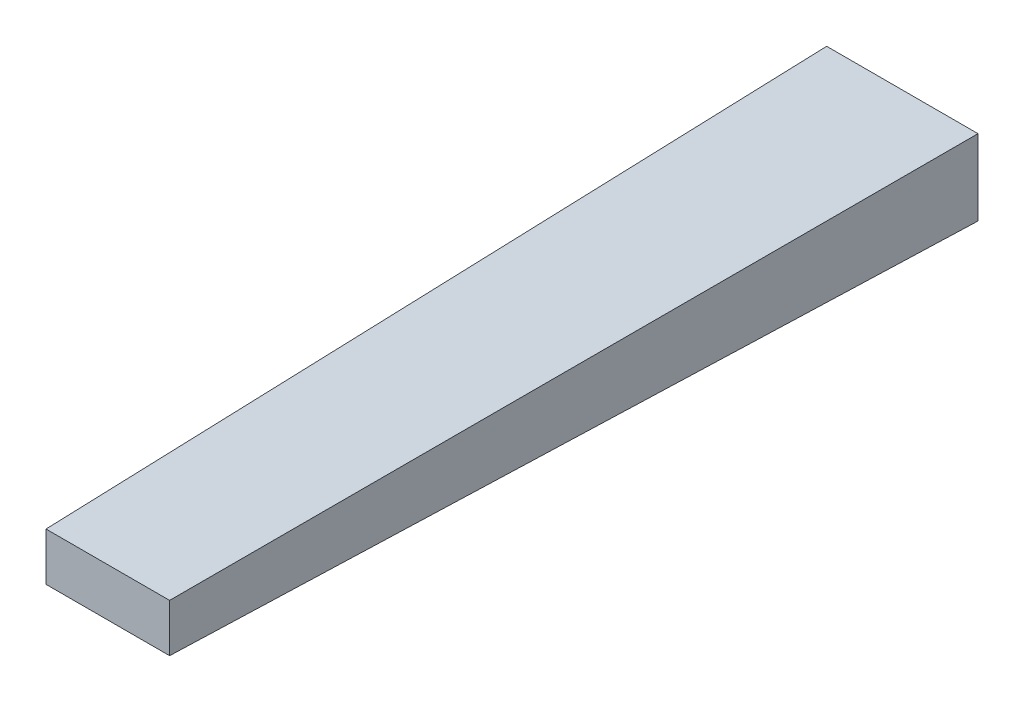
ISO-10303-21;
HEADER;
FILE_DESCRIPTION(('STEP AP214'),'2;1');
FILE_NAME('part.step','',(''),(''),'','','');
FILE_SCHEMA(('AUTOMOTIVE_DESIGN { 1 0 10303 214 1 1 1 1 }'));
ENDSEC;
DATA;
#1=APPLICATION_CONTEXT('core data for automotive mechanical design processes');
#2=APPLICATION_PROTOCOL_DEFINITION('international standard','automotive_design',2000,#1);
#3=PRODUCT_CONTEXT('',#1,'mechanical');
#4=PRODUCT('Part','Part','',(#3));
#5=PRODUCT_RELATED_PRODUCT_CATEGORY('part','',(#4));
#6=PRODUCT_DEFINITION_FORMATION('','',#4);
#7=PRODUCT_DEFINITION_CONTEXT('part definition',#1,'design');
#8=PRODUCT_DEFINITION('design','',#6,#7);
#9=PRODUCT_DEFINITION_SHAPE('','',#8);
#10=(LENGTH_UNIT() NAMED_UNIT(*) SI_UNIT(.MILLI.,.METRE.));
#11=(NAMED_UNIT(*) PLANE_ANGLE_UNIT() SI_UNIT($,.RADIAN.));
#12=(NAMED_UNIT(*) SI_UNIT($,.STERADIAN.) SOLID_ANGLE_UNIT());
#13=UNCERTAINTY_MEASURE_WITH_UNIT(LENGTH_MEASURE(1.E-05),#10,'distance_accuracy_value','');
#14=(GEOMETRIC_REPRESENTATION_CONTEXT(3) GLOBAL_UNCERTAINTY_ASSIGNED_CONTEXT((#13)) GLOBAL_UNIT_ASSIGNED_CONTEXT((#10,
#11,#12)) REPRESENTATION_CONTEXT('',''));
#15=CARTESIAN_POINT('',(0.,0.,0.));
#16=DIRECTION('',(0.,0.,1.));
#17=DIRECTION('',(1.,0.,0.));
#18=AXIS2_PLACEMENT_3D('',#15,#16,#17);
#19=CARTESIAN_POINT('',(100.,50.,0.));
#20=DIRECTION('',(0.999847695156391,0.,0.0174524064372835));
#21=DIRECTION('',(0.0174524064372835,0.,-0.999847695156391));
#22=AXIS2_PLACEMENT_3D('',#19,#20,#21);
#23=PLANE('',#22);
#24=DIRECTION('',(0.,1.,0.));
#25=VECTOR('',#24,1.);
#26=CARTESIAN_POINT('',(100.,50.,0.));
#27=LINE('',#26,#25);
#28=CARTESIAN_POINT('',(100.,-50.,0.));
#29=VERTEX_POINT('',#28);
#30=CARTESIAN_POINT('',(100.,50.,0.));
#31=VERTEX_POINT('',#30);
#32=EDGE_CURVE('E87',#29,#31,#27,.T.);
#33=ORIENTED_EDGE('',*,*,#32,.T.);
#34=DIRECTION('',(0.0174497491606827,0.0174497491606827,-0.999695459881887));
#35=VECTOR('',#34,1.);
#36=CARTESIAN_POINT('',(99.9391012508459,49.9391012508459,3.48888700240246));
#37=LINE('',#36,#35);
#38=CARTESIAN_POINT('',(81.6721818253715,31.6721818253715,1050.));
#39=VERTEX_POINT('',#38);
#40=EDGE_CURVE('E11',#39,#31,#37,.T.);
#41=ORIENTED_EDGE('',*,*,#40,.F.);
#42=DIRECTION('',(0.,-1.,0.));
#43=VECTOR('',#42,1.);
#44=CARTESIAN_POINT('',(81.6721818253715,50.,1050.));
#45=LINE('',#44,#43);
#46=CARTESIAN_POINT('',(81.6721818253715,-31.6721818253715,1050.));
#47=VERTEX_POINT('',#46);
#48=EDGE_CURVE('E103',#47,#39,#45,.F.);
#49=ORIENTED_EDGE('',*,*,#48,.F.);
#50=DIRECTION('',(0.0174497491606827,-0.0174497491606827,-0.999695459881888));
#51=VECTOR('',#50,1.);
#52=CARTESIAN_POINT('',(99.9695506254229,-49.9695506254229,1.74444350120123));
#53=LINE('',#52,#51);
#54=EDGE_CURVE('E98',#47,#29,#53,.T.);
#55=ORIENTED_EDGE('',*,*,#54,.T.);
#56=EDGE_LOOP('',(#33,#41,#49,#55));
#57=FACE_BOUND('',#56,.T.);
#58=ADVANCED_FACE('F41',(#57),#23,.T.);
#59=CARTESIAN_POINT('',(-100.,50.,0.));
#60=DIRECTION('',(0.,0.999847695156391,0.0174524064372835));
#61=DIRECTION('',(0.,-0.0174524064372835,0.999847695156391));
#62=AXIS2_PLACEMENT_3D('',#59,#60,#61);
#63=PLANE('',#62);
#64=DIRECTION('',(-1.,0.,0.));
#65=VECTOR('',#64,1.);
#66=CARTESIAN_POINT('',(-100.,50.,0.));
#67=LINE('',#66,#65);
#68=CARTESIAN_POINT('',(-100.,50.,0.));
#69=VERTEX_POINT('',#68);
#70=EDGE_CURVE('E83',#31,#69,#67,.T.);
#71=ORIENTED_EDGE('',*,*,#70,.T.);
#72=DIRECTION('',(-0.0174497491606827,0.0174497491606827,-0.999695459881887));
#73=VECTOR('',#72,1.);
#74=CARTESIAN_POINT('',(-100.,50.,0.));
#75=LINE('',#74,#73);
#76=CARTESIAN_POINT('',(-81.6721818253715,31.6721818253715,1050.));
#77=VERTEX_POINT('',#76);
#78=EDGE_CURVE('E50',#77,#69,#75,.T.);
#79=ORIENTED_EDGE('',*,*,#78,.F.);
#80=DIRECTION('',(1.,0.,0.));
#81=VECTOR('',#80,1.);
#82=CARTESIAN_POINT('',(-100.,31.6721818253715,1050.));
#83=LINE('',#82,#81);
#84=EDGE_CURVE('E94',#39,#77,#83,.F.);
#85=ORIENTED_EDGE('',*,*,#84,.F.);
#86=ORIENTED_EDGE('',*,*,#40,.T.);
#87=EDGE_LOOP('',(#71,#79,#85,#86));
#88=FACE_BOUND('',#87,.T.);
#89=ADVANCED_FACE('F43',(#88),#63,.T.);
#90=CARTESIAN_POINT('',(-100.,50.,0.));
#91=DIRECTION('',(-0.999847695156391,0.,0.0174524064372835));
#92=DIRECTION('',(0.0174524064372835,0.,0.999847695156391));
#93=AXIS2_PLACEMENT_3D('',#90,#91,#92);
#94=PLANE('',#93);
#95=DIRECTION('',(0.,-1.,0.));
#96=VECTOR('',#95,1.);
#97=CARTESIAN_POINT('',(-100.,50.,0.));
#98=LINE('',#97,#96);
#99=CARTESIAN_POINT('',(-100.,-50.,0.));
#100=VERTEX_POINT('',#99);
#101=EDGE_CURVE('E88',#69,#100,#98,.T.);
#102=ORIENTED_EDGE('',*,*,#101,.T.);
#103=DIRECTION('',(-0.0174497491606827,-0.0174497491606827,-0.999695459881888));
#104=VECTOR('',#103,1.);
#105=CARTESIAN_POINT('',(-100.,-50.,0.));
#106=LINE('',#105,#104);
#107=CARTESIAN_POINT('',(-81.6721818253715,-31.6721818253715,1050.));
#108=VERTEX_POINT('',#107);
#109=EDGE_CURVE('E106',#108,#100,#106,.T.);
#110=ORIENTED_EDGE('',*,*,#109,.F.);
#111=DIRECTION('',(0.,1.,0.));
#112=VECTOR('',#111,1.);
#113=CARTESIAN_POINT('',(-81.6721818253715,50.,1050.));
#114=LINE('',#113,#112);
#115=EDGE_CURVE('E62',#77,#108,#114,.F.);
#116=ORIENTED_EDGE('',*,*,#115,.F.);
#117=ORIENTED_EDGE('',*,*,#78,.T.);
#118=EDGE_LOOP('',(#102,#110,#116,#117));
#119=FACE_BOUND('',#118,.T.);
#120=ADVANCED_FACE('F113',(#119),#94,.T.);
#121=CARTESIAN_POINT('',(-100.,-50.,0.));
#122=DIRECTION('',(0.,-0.999847695156391,0.0174524064372835));
#123=DIRECTION('',(0.,-0.0174524064372836,-0.999847695156391));
#124=AXIS2_PLACEMENT_3D('',#121,#122,#123);
#125=PLANE('',#124);
#126=DIRECTION('',(1.,0.,0.));
#127=VECTOR('',#126,1.);
#128=CARTESIAN_POINT('',(-100.,-50.,0.));
#129=LINE('',#128,#127);
#130=EDGE_CURVE('E102',#100,#29,#129,.T.);
#131=ORIENTED_EDGE('',*,*,#130,.T.);
#132=ORIENTED_EDGE('',*,*,#54,.F.);
#133=DIRECTION('',(-1.,0.,0.));
#134=VECTOR('',#133,1.);
#135=CARTESIAN_POINT('',(-100.,-31.6721818253715,1050.));
#136=LINE('',#135,#134);
#137=EDGE_CURVE('E45',#108,#47,#136,.F.);
#138=ORIENTED_EDGE('',*,*,#137,.F.);
#139=ORIENTED_EDGE('',*,*,#109,.T.);
#140=EDGE_LOOP('',(#131,#132,#138,#139));
#141=FACE_BOUND('',#140,.T.);
#142=ADVANCED_FACE('F115',(#141),#125,.T.);
#143=CARTESIAN_POINT('',(0.,0.,1050.));
#144=DIRECTION('',(0.,0.,1.));
#145=DIRECTION('',(1.,0.,0.));
#146=AXIS2_PLACEMENT_3D('',#143,#144,#145);
#147=PLANE('',#146);
#148=ORIENTED_EDGE('',*,*,#48,.T.);
#149=ORIENTED_EDGE('',*,*,#84,.T.);
#150=ORIENTED_EDGE('',*,*,#115,.T.);
#151=ORIENTED_EDGE('',*,*,#137,.T.);
#152=EDGE_LOOP('',(#148,#149,#150,#151));
#153=FACE_BOUND('',#152,.T.);
#154=ADVANCED_FACE('F111',(#153),#147,.T.);
#155=CARTESIAN_POINT('',(0.,0.,0.));
#156=DIRECTION('',(0.,0.,1.));
#157=DIRECTION('',(1.,0.,0.));
#158=AXIS2_PLACEMENT_3D('',#155,#156,#157);
#159=PLANE('',#158);
#160=ORIENTED_EDGE('',*,*,#32,.F.);
#161=ORIENTED_EDGE('',*,*,#130,.F.);
#162=ORIENTED_EDGE('',*,*,#101,.F.);
#163=ORIENTED_EDGE('',*,*,#70,.F.);
#164=EDGE_LOOP('',(#160,#161,#162,#163));
#165=FACE_BOUND('',#164,.T.);
#166=ADVANCED_FACE('F84',(#165),#159,.F.);
#167=CLOSED_SHELL('',(#58,#89,#120,#142,#154,#166));
#168=MANIFOLD_SOLID_BREP('B2',#167);
#169=ADVANCED_BREP_SHAPE_REPRESENTATION('',(#18,#168),#14);
#170=SHAPE_DEFINITION_REPRESENTATION(#9,#169);
ENDSEC;
END-ISO-10303-21;
